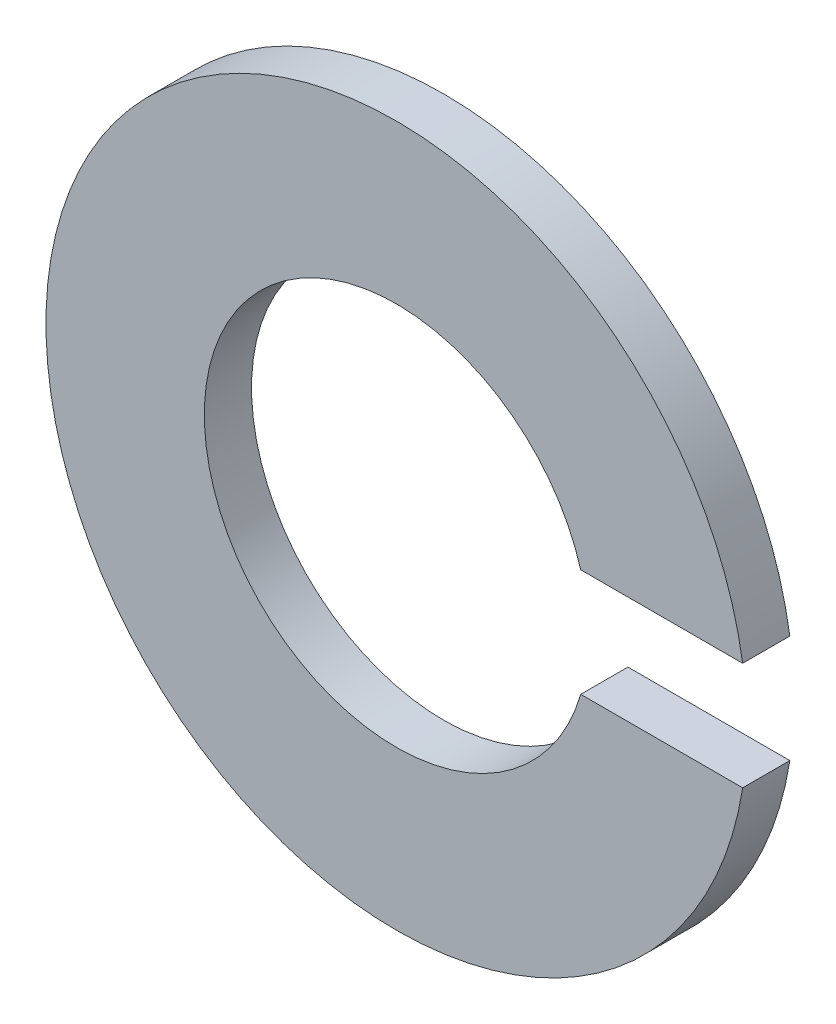
ISO-10303-21;
HEADER;
FILE_DESCRIPTION(('STEP AP214'),'2;1');
FILE_NAME('part.step','',(''),(''),'','','');
FILE_SCHEMA(('AUTOMOTIVE_DESIGN { 1 0 10303 214 1 1 1 1 }'));
ENDSEC;
DATA;
#1=APPLICATION_CONTEXT('core data for automotive mechanical design processes');
#2=APPLICATION_PROTOCOL_DEFINITION('international standard','automotive_design',2000,#1);
#3=PRODUCT_CONTEXT('',#1,'mechanical');
#4=PRODUCT('Part','Part','',(#3));
#5=PRODUCT_RELATED_PRODUCT_CATEGORY('part','',(#4));
#6=PRODUCT_DEFINITION_FORMATION('','',#4);
#7=PRODUCT_DEFINITION_CONTEXT('part definition',#1,'design');
#8=PRODUCT_DEFINITION('design','',#6,#7);
#9=PRODUCT_DEFINITION_SHAPE('','',#8);
#10=(LENGTH_UNIT() NAMED_UNIT(*) SI_UNIT(.MILLI.,.METRE.));
#11=(NAMED_UNIT(*) PLANE_ANGLE_UNIT() SI_UNIT($,.RADIAN.));
#12=(NAMED_UNIT(*) SI_UNIT($,.STERADIAN.) SOLID_ANGLE_UNIT());
#13=UNCERTAINTY_MEASURE_WITH_UNIT(LENGTH_MEASURE(1.E-05),#10,'distance_accuracy_value','');
#14=(GEOMETRIC_REPRESENTATION_CONTEXT(3) GLOBAL_UNCERTAINTY_ASSIGNED_CONTEXT((#13)) GLOBAL_UNIT_ASSIGNED_CONTEXT((#10,
#11,#12)) REPRESENTATION_CONTEXT('',''));
#15=CARTESIAN_POINT('',(0.,0.,0.));
#16=DIRECTION('',(0.,0.,1.));
#17=DIRECTION('',(1.,0.,0.));
#18=AXIS2_PLACEMENT_3D('',#15,#16,#17);
#19=CARTESIAN_POINT('',(0.,0.,0.7));
#20=DIRECTION('',(0.,0.,1.));
#21=DIRECTION('',(1.,0.,0.));
#22=AXIS2_PLACEMENT_3D('',#19,#20,#21);
#23=PLANE('',#22);
#24=DIRECTION('',(1.,0.,0.));
#25=VECTOR('',#24,1.);
#26=CARTESIAN_POINT('',(0.,-0.8,0.7));
#27=LINE('',#26,#25);
#28=CARTESIAN_POINT('',(2.73541587331799,-0.8,0.7));
#29=VERTEX_POINT('',#28);
#30=CARTESIAN_POINT('',(5.13809303146605,-0.8,0.7));
#31=VERTEX_POINT('',#30);
#32=EDGE_CURVE('E76',#29,#31,#27,.T.);
#33=ORIENTED_EDGE('',*,*,#32,.F.);
#34=CARTESIAN_POINT('',(0.,0.,0.7));
#35=DIRECTION('',(0.,0.,1.));
#36=DIRECTION('',(1.,0.,0.));
#37=AXIS2_PLACEMENT_3D('',#34,#35,#36);
#38=CIRCLE('',#37,2.85);
#39=CARTESIAN_POINT('',(2.73541587331799,0.8,0.7));
#40=VERTEX_POINT('',#39);
#41=EDGE_CURVE('E89',#40,#29,#38,.T.);
#42=ORIENTED_EDGE('',*,*,#41,.F.);
#43=DIRECTION('',(-1.,0.,0.));
#44=VECTOR('',#43,1.);
#45=CARTESIAN_POINT('',(0.,0.8,0.7));
#46=LINE('',#45,#44);
#47=CARTESIAN_POINT('',(5.13809303146605,0.8,0.7));
#48=VERTEX_POINT('',#47);
#49=EDGE_CURVE('E61',#48,#40,#46,.T.);
#50=ORIENTED_EDGE('',*,*,#49,.F.);
#51=CARTESIAN_POINT('',(0.,0.,0.7));
#52=DIRECTION('',(0.,0.,1.));
#53=DIRECTION('',(1.,0.,0.));
#54=AXIS2_PLACEMENT_3D('',#51,#52,#53);
#55=CIRCLE('',#54,5.2);
#56=EDGE_CURVE('E83',#48,#31,#55,.T.);
#57=ORIENTED_EDGE('',*,*,#56,.T.);
#58=EDGE_LOOP('',(#33,#42,#50,#57));
#59=FACE_BOUND('',#58,.T.);
#60=ADVANCED_FACE('F39',(#59),#23,.T.);
#61=CARTESIAN_POINT('',(0.,0.,0.));
#62=DIRECTION('',(0.,0.,1.));
#63=DIRECTION('',(1.,0.,0.));
#64=AXIS2_PLACEMENT_3D('',#61,#62,#63);
#65=PLANE('',#64);
#66=CARTESIAN_POINT('',(0.,0.,0.));
#67=DIRECTION('',(0.,0.,1.));
#68=DIRECTION('',(1.,0.,0.));
#69=AXIS2_PLACEMENT_3D('',#66,#67,#68);
#70=CIRCLE('',#69,5.2);
#71=CARTESIAN_POINT('',(5.13809303146605,0.8,0.));
#72=VERTEX_POINT('',#71);
#73=CARTESIAN_POINT('',(5.13809303146605,-0.8,0.));
#74=VERTEX_POINT('',#73);
#75=EDGE_CURVE('E95',#72,#74,#70,.T.);
#76=ORIENTED_EDGE('',*,*,#75,.F.);
#77=DIRECTION('',(-1.,0.,0.));
#78=VECTOR('',#77,1.);
#79=CARTESIAN_POINT('',(0.,0.8,0.));
#80=LINE('',#79,#78);
#81=CARTESIAN_POINT('',(2.73541587331799,0.8,0.));
#82=VERTEX_POINT('',#81);
#83=EDGE_CURVE('E101',#72,#82,#80,.T.);
#84=ORIENTED_EDGE('',*,*,#83,.T.);
#85=CARTESIAN_POINT('',(0.,0.,0.));
#86=DIRECTION('',(0.,0.,1.));
#87=DIRECTION('',(1.,0.,0.));
#88=AXIS2_PLACEMENT_3D('',#85,#86,#87);
#89=CIRCLE('',#88,2.85);
#90=CARTESIAN_POINT('',(2.73541587331799,-0.8,0.));
#91=VERTEX_POINT('',#90);
#92=EDGE_CURVE('E92',#82,#91,#89,.T.);
#93=ORIENTED_EDGE('',*,*,#92,.T.);
#94=DIRECTION('',(1.,0.,0.));
#95=VECTOR('',#94,1.);
#96=CARTESIAN_POINT('',(0.,-0.8,0.));
#97=LINE('',#96,#95);
#98=EDGE_CURVE('E53',#91,#74,#97,.T.);
#99=ORIENTED_EDGE('',*,*,#98,.T.);
#100=EDGE_LOOP('',(#76,#84,#93,#99));
#101=FACE_BOUND('',#100,.T.);
#102=ADVANCED_FACE('F111',(#101),#65,.F.);
#103=CARTESIAN_POINT('',(0.,0.,0.7));
#104=DIRECTION('',(0.,0.,-1.));
#105=DIRECTION('',(-1.,0.,0.));
#106=AXIS2_PLACEMENT_3D('',#103,#104,#105);
#107=CYLINDRICAL_SURFACE('',#106,5.2);
#108=ORIENTED_EDGE('',*,*,#56,.F.);
#109=DIRECTION('',(0.,0.,-1.));
#110=VECTOR('',#109,1.);
#111=CARTESIAN_POINT('',(5.13809303146605,0.8,0.7));
#112=LINE('',#111,#110);
#113=EDGE_CURVE('E97',#48,#72,#112,.T.);
#114=ORIENTED_EDGE('',*,*,#113,.T.);
#115=ORIENTED_EDGE('',*,*,#75,.T.);
#116=DIRECTION('',(0.,0.,-1.));
#117=VECTOR('',#116,1.);
#118=CARTESIAN_POINT('',(5.13809303146605,-0.8,0.7));
#119=LINE('',#118,#117);
#120=EDGE_CURVE('E106',#74,#31,#119,.F.);
#121=ORIENTED_EDGE('',*,*,#120,.T.);
#122=EDGE_LOOP('',(#108,#114,#115,#121));
#123=FACE_BOUND('',#122,.T.);
#124=ADVANCED_FACE('F41',(#123),#107,.T.);
#125=CARTESIAN_POINT('',(0.,0.,0.7));
#126=DIRECTION('',(0.,0.,-1.));
#127=DIRECTION('',(-1.,0.,0.));
#128=AXIS2_PLACEMENT_3D('',#125,#126,#127);
#129=CYLINDRICAL_SURFACE('',#128,2.85);
#130=DIRECTION('',(0.,0.,-1.));
#131=VECTOR('',#130,1.);
#132=CARTESIAN_POINT('',(2.73541587331799,0.8,0.7));
#133=LINE('',#132,#131);
#134=EDGE_CURVE('E11',#40,#82,#133,.T.);
#135=ORIENTED_EDGE('',*,*,#134,.F.);
#136=ORIENTED_EDGE('',*,*,#41,.T.);
#137=DIRECTION('',(0.,0.,-1.));
#138=VECTOR('',#137,1.);
#139=CARTESIAN_POINT('',(2.73541587331799,-0.8,0.7));
#140=LINE('',#139,#138);
#141=EDGE_CURVE('E50',#91,#29,#140,.F.);
#142=ORIENTED_EDGE('',*,*,#141,.F.);
#143=ORIENTED_EDGE('',*,*,#92,.F.);
#144=EDGE_LOOP('',(#135,#136,#142,#143));
#145=FACE_BOUND('',#144,.T.);
#146=ADVANCED_FACE('F91',(#145),#129,.F.);
#147=CARTESIAN_POINT('',(0.,-0.8,-0.01));
#148=DIRECTION('',(0.,-1.,0.));
#149=DIRECTION('',(0.,0.,-1.));
#150=AXIS2_PLACEMENT_3D('',#147,#148,#149);
#151=PLANE('',#150);
#152=ORIENTED_EDGE('',*,*,#98,.F.);
#153=ORIENTED_EDGE('',*,*,#141,.T.);
#154=ORIENTED_EDGE('',*,*,#32,.T.);
#155=ORIENTED_EDGE('',*,*,#120,.F.);
#156=EDGE_LOOP('',(#152,#153,#154,#155));
#157=FACE_BOUND('',#156,.T.);
#158=ADVANCED_FACE('F80',(#157),#151,.F.);
#159=CARTESIAN_POINT('',(0.,0.8,-0.01));
#160=DIRECTION('',(0.,1.,0.));
#161=DIRECTION('',(0.,0.,1.));
#162=AXIS2_PLACEMENT_3D('',#159,#160,#161);
#163=PLANE('',#162);
#164=ORIENTED_EDGE('',*,*,#49,.T.);
#165=ORIENTED_EDGE('',*,*,#134,.T.);
#166=ORIENTED_EDGE('',*,*,#83,.F.);
#167=ORIENTED_EDGE('',*,*,#113,.F.);
#168=EDGE_LOOP('',(#164,#165,#166,#167));
#169=FACE_BOUND('',#168,.T.);
#170=ADVANCED_FACE('F113',(#169),#163,.F.);
#171=CLOSED_SHELL('',(#60,#102,#124,#146,#158,#170));
#172=MANIFOLD_SOLID_BREP('B2',#171);
#173=ADVANCED_BREP_SHAPE_REPRESENTATION('',(#18,#172),#14);
#174=SHAPE_DEFINITION_REPRESENTATION(#9,#173);
ENDSEC;
END-ISO-10303-21;
